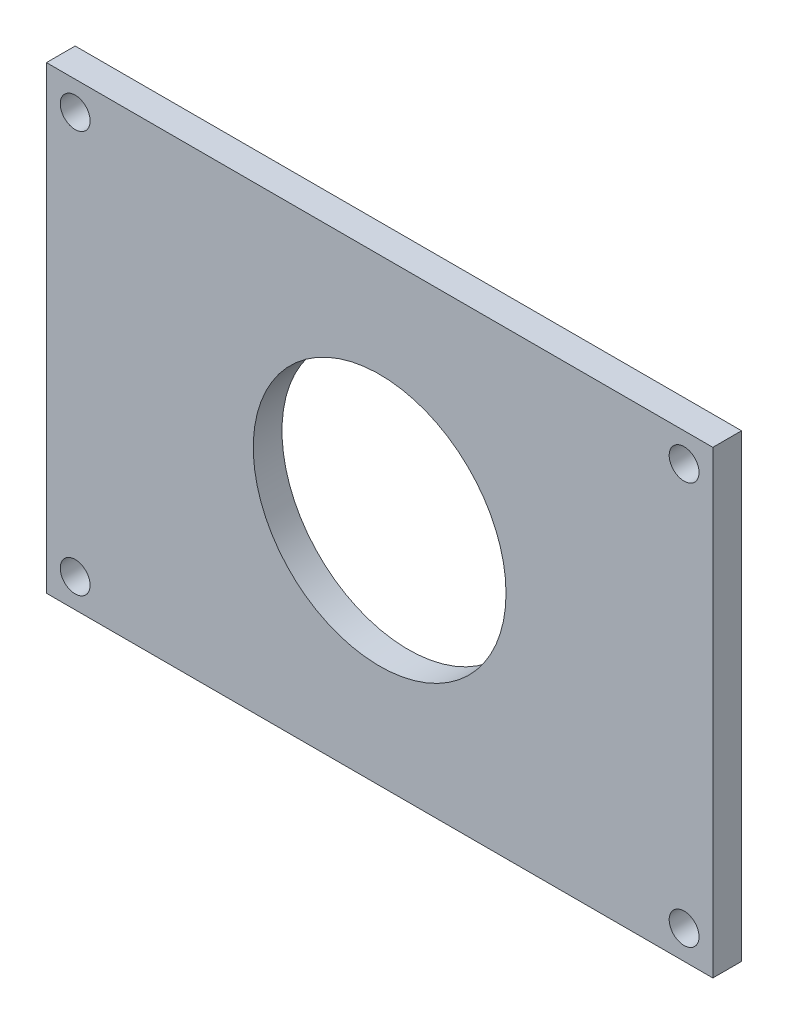
ISO-10303-21;
HEADER;
FILE_DESCRIPTION(('STEP AP214'),'2;1');
FILE_NAME('part.step','',(''),(''),'','','');
FILE_SCHEMA(('AUTOMOTIVE_DESIGN { 1 0 10303 214 1 1 1 1 }'));
ENDSEC;
DATA;
#1=APPLICATION_CONTEXT('core data for automotive mechanical design processes');
#2=APPLICATION_PROTOCOL_DEFINITION('international standard','automotive_design',2000,#1);
#3=PRODUCT_CONTEXT('',#1,'mechanical');
#4=PRODUCT('Part','Part','',(#3));
#5=PRODUCT_RELATED_PRODUCT_CATEGORY('part','',(#4));
#6=PRODUCT_DEFINITION_FORMATION('','',#4);
#7=PRODUCT_DEFINITION_CONTEXT('part definition',#1,'design');
#8=PRODUCT_DEFINITION('design','',#6,#7);
#9=PRODUCT_DEFINITION_SHAPE('','',#8);
#10=(LENGTH_UNIT() NAMED_UNIT(*) SI_UNIT(.MILLI.,.METRE.));
#11=(NAMED_UNIT(*) PLANE_ANGLE_UNIT() SI_UNIT($,.RADIAN.));
#12=(NAMED_UNIT(*) SI_UNIT($,.STERADIAN.) SOLID_ANGLE_UNIT());
#13=UNCERTAINTY_MEASURE_WITH_UNIT(LENGTH_MEASURE(1.E-05),#10,'distance_accuracy_value','');
#14=(GEOMETRIC_REPRESENTATION_CONTEXT(3) GLOBAL_UNCERTAINTY_ASSIGNED_CONTEXT((#13)) GLOBAL_UNIT_ASSIGNED_CONTEXT((#10,
#11,#12)) REPRESENTATION_CONTEXT('',''));
#15=CARTESIAN_POINT('',(0.,0.,0.));
#16=DIRECTION('',(0.,0.,1.));
#17=DIRECTION('',(1.,0.,0.));
#18=AXIS2_PLACEMENT_3D('',#15,#16,#17);
#19=CARTESIAN_POINT('',(0.,0.,72.5));
#20=DIRECTION('',(0.,0.,-1.));
#21=DIRECTION('',(-1.,0.,0.));
#22=AXIS2_PLACEMENT_3D('',#19,#20,#21);
#23=PLANE('',#22);
#24=DIRECTION('',(0.,1.,0.));
#25=VECTOR('',#24,1.);
#26=CARTESIAN_POINT('',(29.,-20.,72.5));
#27=LINE('',#26,#25);
#28=CARTESIAN_POINT('',(29.,-20.,72.5));
#29=VERTEX_POINT('',#28);
#30=CARTESIAN_POINT('',(29.,20.,72.5));
#31=VERTEX_POINT('',#30);
#32=EDGE_CURVE('E110',#29,#31,#27,.T.);
#33=ORIENTED_EDGE('',*,*,#32,.T.);
#34=DIRECTION('',(-1.,0.,0.));
#35=VECTOR('',#34,1.);
#36=CARTESIAN_POINT('',(-29.,20.,72.5));
#37=LINE('',#36,#35);
#38=CARTESIAN_POINT('',(-29.,20.,72.5));
#39=VERTEX_POINT('',#38);
#40=EDGE_CURVE('E105',#31,#39,#37,.T.);
#41=ORIENTED_EDGE('',*,*,#40,.T.);
#42=DIRECTION('',(0.,-1.,0.));
#43=VECTOR('',#42,1.);
#44=CARTESIAN_POINT('',(-29.,-20.,72.5));
#45=LINE('',#44,#43);
#46=CARTESIAN_POINT('',(-29.,-20.,72.5));
#47=VERTEX_POINT('',#46);
#48=EDGE_CURVE('E108',#39,#47,#45,.T.);
#49=ORIENTED_EDGE('',*,*,#48,.T.);
#50=DIRECTION('',(1.,0.,0.));
#51=VECTOR('',#50,1.);
#52=CARTESIAN_POINT('',(-29.,-20.,72.5));
#53=LINE('',#52,#51);
#54=EDGE_CURVE('E75',#47,#29,#53,.T.);
#55=ORIENTED_EDGE('',*,*,#54,.T.);
#56=EDGE_LOOP('',(#33,#41,#49,#55));
#57=FACE_BOUND('',#56,.T.);
#58=CARTESIAN_POINT('',(-26.5,17.5,72.5));
#59=DIRECTION('',(0.,0.,1.));
#60=DIRECTION('',(1.,0.,0.));
#61=AXIS2_PLACEMENT_3D('',#58,#59,#60);
#62=CIRCLE('',#61,1.3);
#63=CARTESIAN_POINT('',(-25.2,17.5,72.5));
#64=VERTEX_POINT('',#63);
#65=EDGE_CURVE('E125',#64,#64,#62,.T.);
#66=ORIENTED_EDGE('',*,*,#65,.F.);
#67=EDGE_LOOP('',(#66));
#68=FACE_BOUND('',#67,.T.);
#69=CARTESIAN_POINT('',(-26.5,-17.5,72.5));
#70=DIRECTION('',(0.,0.,1.));
#71=DIRECTION('',(1.,0.,0.));
#72=AXIS2_PLACEMENT_3D('',#69,#70,#71);
#73=CIRCLE('',#72,1.3);
#74=CARTESIAN_POINT('',(-25.2,-17.5,72.5));
#75=VERTEX_POINT('',#74);
#76=EDGE_CURVE('E140',#75,#75,#73,.T.);
#77=ORIENTED_EDGE('',*,*,#76,.F.);
#78=EDGE_LOOP('',(#77));
#79=FACE_BOUND('',#78,.T.);
#80=CARTESIAN_POINT('',(26.5,-17.5,72.5));
#81=DIRECTION('',(0.,0.,1.));
#82=DIRECTION('',(1.,0.,0.));
#83=AXIS2_PLACEMENT_3D('',#80,#81,#82);
#84=CIRCLE('',#83,1.3);
#85=CARTESIAN_POINT('',(27.8,-17.5,72.5));
#86=VERTEX_POINT('',#85);
#87=EDGE_CURVE('E146',#86,#86,#84,.T.);
#88=ORIENTED_EDGE('',*,*,#87,.F.);
#89=EDGE_LOOP('',(#88));
#90=FACE_BOUND('',#89,.T.);
#91=CARTESIAN_POINT('',(26.5,17.5,72.5));
#92=DIRECTION('',(0.,0.,1.));
#93=DIRECTION('',(1.,0.,0.));
#94=AXIS2_PLACEMENT_3D('',#91,#92,#93);
#95=CIRCLE('',#94,1.3);
#96=CARTESIAN_POINT('',(27.8,17.5,72.5));
#97=VERTEX_POINT('',#96);
#98=EDGE_CURVE('E152',#97,#97,#95,.T.);
#99=ORIENTED_EDGE('',*,*,#98,.F.);
#100=EDGE_LOOP('',(#99));
#101=FACE_BOUND('',#100,.T.);
#102=CARTESIAN_POINT('',(0.,0.,72.5));
#103=DIRECTION('',(0.,0.,1.));
#104=DIRECTION('',(1.,0.,0.));
#105=AXIS2_PLACEMENT_3D('',#102,#103,#104);
#106=CIRCLE('',#105,11.);
#107=CARTESIAN_POINT('',(11.,0.,72.5));
#108=VERTEX_POINT('',#107);
#109=EDGE_CURVE('E158',#108,#108,#106,.T.);
#110=ORIENTED_EDGE('',*,*,#109,.F.);
#111=EDGE_LOOP('',(#110));
#112=FACE_BOUND('',#111,.T.);
#113=ADVANCED_FACE('F58',(#57,#68,#79,#90,#101,#112),#23,.F.);
#114=CARTESIAN_POINT('',(0.,0.,70.));
#115=DIRECTION('',(0.,0.,-1.));
#116=DIRECTION('',(-1.,0.,0.));
#117=AXIS2_PLACEMENT_3D('',#114,#115,#116);
#118=PLANE('',#117);
#119=CARTESIAN_POINT('',(26.5,17.5,70.));
#120=DIRECTION('',(0.,0.,1.));
#121=DIRECTION('',(1.,0.,0.));
#122=AXIS2_PLACEMENT_3D('',#119,#120,#121);
#123=CIRCLE('',#122,1.3);
#124=CARTESIAN_POINT('',(27.8,17.5,70.));
#125=VERTEX_POINT('',#124);
#126=EDGE_CURVE('E155',#125,#125,#123,.T.);
#127=ORIENTED_EDGE('',*,*,#126,.T.);
#128=EDGE_LOOP('',(#127));
#129=FACE_BOUND('',#128,.T.);
#130=CARTESIAN_POINT('',(-26.5,-17.5,70.));
#131=DIRECTION('',(0.,0.,1.));
#132=DIRECTION('',(1.,0.,0.));
#133=AXIS2_PLACEMENT_3D('',#130,#131,#132);
#134=CIRCLE('',#133,1.3);
#135=CARTESIAN_POINT('',(-25.2,-17.5,70.));
#136=VERTEX_POINT('',#135);
#137=EDGE_CURVE('E143',#136,#136,#134,.T.);
#138=ORIENTED_EDGE('',*,*,#137,.T.);
#139=EDGE_LOOP('',(#138));
#140=FACE_BOUND('',#139,.T.);
#141=DIRECTION('',(0.,1.,0.));
#142=VECTOR('',#141,1.);
#143=CARTESIAN_POINT('',(29.,-20.,70.));
#144=LINE('',#143,#142);
#145=CARTESIAN_POINT('',(29.,-20.,70.));
#146=VERTEX_POINT('',#145);
#147=CARTESIAN_POINT('',(29.,20.,70.));
#148=VERTEX_POINT('',#147);
#149=EDGE_CURVE('E122',#146,#148,#144,.T.);
#150=ORIENTED_EDGE('',*,*,#149,.F.);
#151=DIRECTION('',(1.,0.,0.));
#152=VECTOR('',#151,1.);
#153=CARTESIAN_POINT('',(-29.,-20.,70.));
#154=LINE('',#153,#152);
#155=CARTESIAN_POINT('',(-29.,-20.,70.));
#156=VERTEX_POINT('',#155);
#157=EDGE_CURVE('E98',#156,#146,#154,.T.);
#158=ORIENTED_EDGE('',*,*,#157,.F.);
#159=DIRECTION('',(0.,-1.,0.));
#160=VECTOR('',#159,1.);
#161=CARTESIAN_POINT('',(-29.,-20.,70.));
#162=LINE('',#161,#160);
#163=CARTESIAN_POINT('',(-29.,20.,70.));
#164=VERTEX_POINT('',#163);
#165=EDGE_CURVE('E92',#164,#156,#162,.T.);
#166=ORIENTED_EDGE('',*,*,#165,.F.);
#167=DIRECTION('',(-1.,0.,0.));
#168=VECTOR('',#167,1.);
#169=CARTESIAN_POINT('',(-29.,20.,70.));
#170=LINE('',#169,#168);
#171=EDGE_CURVE('E114',#148,#164,#170,.T.);
#172=ORIENTED_EDGE('',*,*,#171,.F.);
#173=EDGE_LOOP('',(#150,#158,#166,#172));
#174=FACE_BOUND('',#173,.T.);
#175=CARTESIAN_POINT('',(-26.5,17.5,70.));
#176=DIRECTION('',(0.,0.,1.));
#177=DIRECTION('',(1.,0.,0.));
#178=AXIS2_PLACEMENT_3D('',#175,#176,#177);
#179=CIRCLE('',#178,1.3);
#180=CARTESIAN_POINT('',(-25.2,17.5,70.));
#181=VERTEX_POINT('',#180);
#182=EDGE_CURVE('E137',#181,#181,#179,.T.);
#183=ORIENTED_EDGE('',*,*,#182,.T.);
#184=EDGE_LOOP('',(#183));
#185=FACE_BOUND('',#184,.T.);
#186=CARTESIAN_POINT('',(26.5,-17.5,70.));
#187=DIRECTION('',(0.,0.,1.));
#188=DIRECTION('',(1.,0.,0.));
#189=AXIS2_PLACEMENT_3D('',#186,#187,#188);
#190=CIRCLE('',#189,1.3);
#191=CARTESIAN_POINT('',(27.8,-17.5,70.));
#192=VERTEX_POINT('',#191);
#193=EDGE_CURVE('E149',#192,#192,#190,.T.);
#194=ORIENTED_EDGE('',*,*,#193,.T.);
#195=EDGE_LOOP('',(#194));
#196=FACE_BOUND('',#195,.T.);
#197=CARTESIAN_POINT('',(0.,0.,70.));
#198=DIRECTION('',(0.,0.,1.));
#199=DIRECTION('',(1.,0.,0.));
#200=AXIS2_PLACEMENT_3D('',#197,#198,#199);
#201=CIRCLE('',#200,11.);
#202=CARTESIAN_POINT('',(11.,0.,70.));
#203=VERTEX_POINT('',#202);
#204=EDGE_CURVE('E161',#203,#203,#201,.T.);
#205=ORIENTED_EDGE('',*,*,#204,.T.);
#206=EDGE_LOOP('',(#205));
#207=FACE_BOUND('',#206,.T.);
#208=ADVANCED_FACE('F133',(#129,#140,#174,#185,#196,#207),#118,.T.);
#209=CARTESIAN_POINT('',(29.,-20.,72.5));
#210=DIRECTION('',(-1.,0.,0.));
#211=DIRECTION('',(0.,0.,1.));
#212=AXIS2_PLACEMENT_3D('',#209,#210,#211);
#213=PLANE('',#212);
#214=ORIENTED_EDGE('',*,*,#149,.T.);
#215=DIRECTION('',(0.,0.,-1.));
#216=VECTOR('',#215,1.);
#217=CARTESIAN_POINT('',(29.,20.,72.5));
#218=LINE('',#217,#216);
#219=EDGE_CURVE('E12',#31,#148,#218,.T.);
#220=ORIENTED_EDGE('',*,*,#219,.F.);
#221=ORIENTED_EDGE('',*,*,#32,.F.);
#222=DIRECTION('',(0.,0.,-1.));
#223=VECTOR('',#222,1.);
#224=CARTESIAN_POINT('',(29.,-20.,72.5));
#225=LINE('',#224,#223);
#226=EDGE_CURVE('E118',#29,#146,#225,.T.);
#227=ORIENTED_EDGE('',*,*,#226,.T.);
#228=EDGE_LOOP('',(#214,#220,#221,#227));
#229=FACE_BOUND('',#228,.T.);
#230=ADVANCED_FACE('F60',(#229),#213,.F.);
#231=CARTESIAN_POINT('',(-29.,20.,72.5));
#232=DIRECTION('',(0.,-1.,0.));
#233=DIRECTION('',(0.,0.,-1.));
#234=AXIS2_PLACEMENT_3D('',#231,#232,#233);
#235=PLANE('',#234);
#236=ORIENTED_EDGE('',*,*,#171,.T.);
#237=DIRECTION('',(0.,0.,-1.));
#238=VECTOR('',#237,1.);
#239=CARTESIAN_POINT('',(-29.,20.,72.5));
#240=LINE('',#239,#238);
#241=EDGE_CURVE('E67',#39,#164,#240,.T.);
#242=ORIENTED_EDGE('',*,*,#241,.F.);
#243=ORIENTED_EDGE('',*,*,#40,.F.);
#244=ORIENTED_EDGE('',*,*,#219,.T.);
#245=EDGE_LOOP('',(#236,#242,#243,#244));
#246=FACE_BOUND('',#245,.T.);
#247=ADVANCED_FACE('F113',(#246),#235,.F.);
#248=CARTESIAN_POINT('',(-29.,-20.,72.5));
#249=DIRECTION('',(1.,0.,0.));
#250=DIRECTION('',(0.,0.,-1.));
#251=AXIS2_PLACEMENT_3D('',#248,#249,#250);
#252=PLANE('',#251);
#253=ORIENTED_EDGE('',*,*,#165,.T.);
#254=DIRECTION('',(0.,0.,-1.));
#255=VECTOR('',#254,1.);
#256=CARTESIAN_POINT('',(-29.,-20.,72.5));
#257=LINE('',#256,#255);
#258=EDGE_CURVE('E115',#47,#156,#257,.T.);
#259=ORIENTED_EDGE('',*,*,#258,.F.);
#260=ORIENTED_EDGE('',*,*,#48,.F.);
#261=ORIENTED_EDGE('',*,*,#241,.T.);
#262=EDGE_LOOP('',(#253,#259,#260,#261));
#263=FACE_BOUND('',#262,.T.);
#264=ADVANCED_FACE('F116',(#263),#252,.F.);
#265=CARTESIAN_POINT('',(-29.,-20.,72.5));
#266=DIRECTION('',(0.,1.,0.));
#267=DIRECTION('',(0.,0.,1.));
#268=AXIS2_PLACEMENT_3D('',#265,#266,#267);
#269=PLANE('',#268);
#270=ORIENTED_EDGE('',*,*,#157,.T.);
#271=ORIENTED_EDGE('',*,*,#226,.F.);
#272=ORIENTED_EDGE('',*,*,#54,.F.);
#273=ORIENTED_EDGE('',*,*,#258,.T.);
#274=EDGE_LOOP('',(#270,#271,#272,#273));
#275=FACE_BOUND('',#274,.T.);
#276=ADVANCED_FACE('F130',(#275),#269,.F.);
#277=CARTESIAN_POINT('',(-26.5,17.5,72.5));
#278=DIRECTION('',(0.,0.,-1.));
#279=DIRECTION('',(-1.,0.,0.));
#280=AXIS2_PLACEMENT_3D('',#277,#278,#279);
#281=CYLINDRICAL_SURFACE('',#280,1.3);
#282=ORIENTED_EDGE('',*,*,#65,.T.);
#283=EDGE_LOOP('',(#282));
#284=FACE_BOUND('',#283,.T.);
#285=ORIENTED_EDGE('',*,*,#182,.F.);
#286=EDGE_LOOP('',(#285));
#287=FACE_BOUND('',#286,.T.);
#288=ADVANCED_FACE('F178',(#284,#287),#281,.F.);
#289=CARTESIAN_POINT('',(-26.5,-17.5,72.5));
#290=DIRECTION('',(0.,0.,-1.));
#291=DIRECTION('',(-1.,0.,0.));
#292=AXIS2_PLACEMENT_3D('',#289,#290,#291);
#293=CYLINDRICAL_SURFACE('',#292,1.3);
#294=ORIENTED_EDGE('',*,*,#76,.T.);
#295=EDGE_LOOP('',(#294));
#296=FACE_BOUND('',#295,.T.);
#297=ORIENTED_EDGE('',*,*,#137,.F.);
#298=EDGE_LOOP('',(#297));
#299=FACE_BOUND('',#298,.T.);
#300=ADVANCED_FACE('F224',(#296,#299),#293,.F.);
#301=CARTESIAN_POINT('',(26.5,-17.5,72.5));
#302=DIRECTION('',(0.,0.,-1.));
#303=DIRECTION('',(-1.,0.,0.));
#304=AXIS2_PLACEMENT_3D('',#301,#302,#303);
#305=CYLINDRICAL_SURFACE('',#304,1.3);
#306=ORIENTED_EDGE('',*,*,#87,.T.);
#307=EDGE_LOOP('',(#306));
#308=FACE_BOUND('',#307,.T.);
#309=ORIENTED_EDGE('',*,*,#193,.F.);
#310=EDGE_LOOP('',(#309));
#311=FACE_BOUND('',#310,.T.);
#312=ADVANCED_FACE('F232',(#308,#311),#305,.F.);
#313=CARTESIAN_POINT('',(26.5,17.5,72.5));
#314=DIRECTION('',(0.,0.,-1.));
#315=DIRECTION('',(-1.,0.,0.));
#316=AXIS2_PLACEMENT_3D('',#313,#314,#315);
#317=CYLINDRICAL_SURFACE('',#316,1.3);
#318=ORIENTED_EDGE('',*,*,#98,.T.);
#319=EDGE_LOOP('',(#318));
#320=FACE_BOUND('',#319,.T.);
#321=ORIENTED_EDGE('',*,*,#126,.F.);
#322=EDGE_LOOP('',(#321));
#323=FACE_BOUND('',#322,.T.);
#324=ADVANCED_FACE('F240',(#320,#323),#317,.F.);
#325=CARTESIAN_POINT('',(0.,0.,72.5));
#326=DIRECTION('',(0.,0.,-1.));
#327=DIRECTION('',(-1.,0.,0.));
#328=AXIS2_PLACEMENT_3D('',#325,#326,#327);
#329=CYLINDRICAL_SURFACE('',#328,11.);
#330=ORIENTED_EDGE('',*,*,#109,.T.);
#331=EDGE_LOOP('',(#330));
#332=FACE_BOUND('',#331,.T.);
#333=ORIENTED_EDGE('',*,*,#204,.F.);
#334=EDGE_LOOP('',(#333));
#335=FACE_BOUND('',#334,.T.);
#336=ADVANCED_FACE('F167',(#332,#335),#329,.F.);
#337=CLOSED_SHELL('',(#113,#208,#230,#247,#264,#276,#288,#300,#312,#324,#336));
#338=MANIFOLD_SOLID_BREP('B2',#337);
#339=ADVANCED_BREP_SHAPE_REPRESENTATION('',(#18,#338),#14);
#340=SHAPE_DEFINITION_REPRESENTATION(#9,#339);
ENDSEC;
END-ISO-10303-21;
